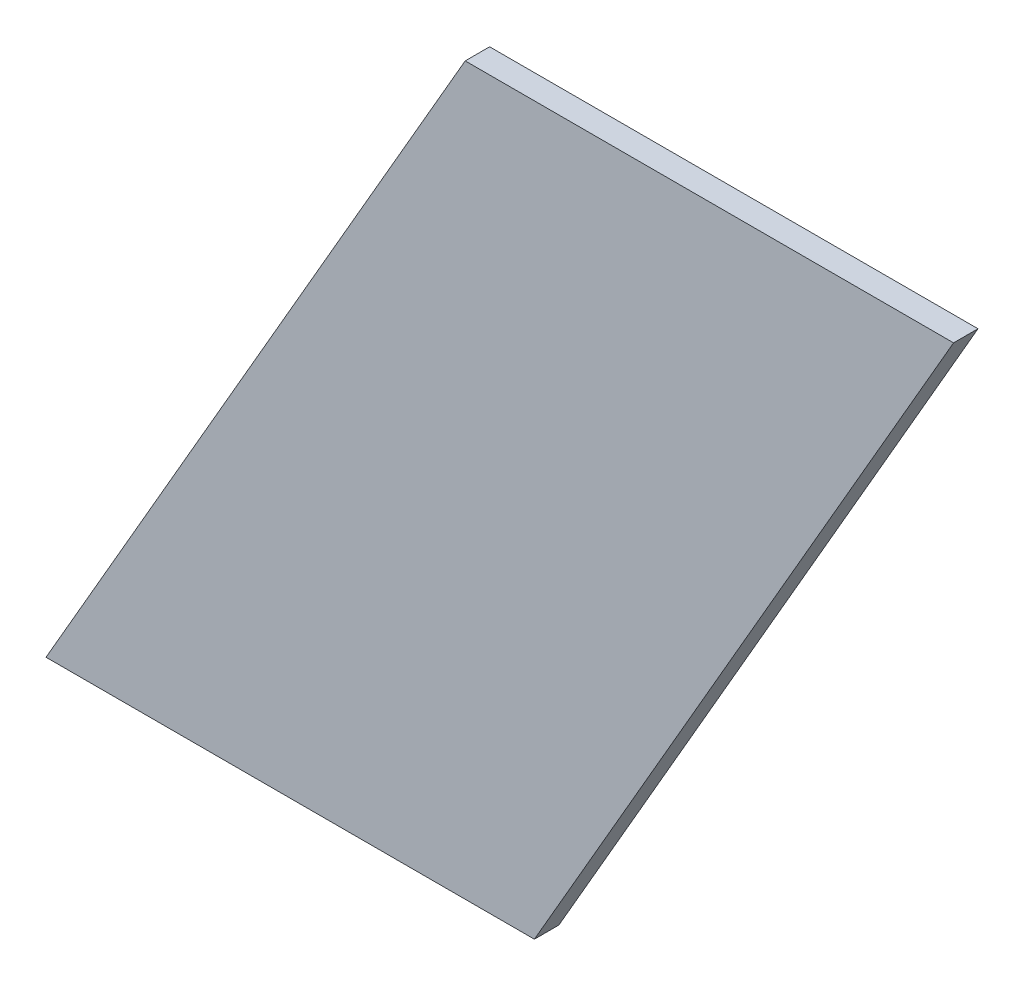
ISO-10303-21;
HEADER;
FILE_DESCRIPTION(('STEP AP214'),'2;1');
FILE_NAME('part.step','',(''),(''),'','','');
FILE_SCHEMA(('AUTOMOTIVE_DESIGN { 1 0 10303 214 1 1 1 1 }'));
ENDSEC;
DATA;
#1=APPLICATION_CONTEXT('core data for automotive mechanical design processes');
#2=APPLICATION_PROTOCOL_DEFINITION('international standard','automotive_design',2000,#1);
#3=PRODUCT_CONTEXT('',#1,'mechanical');
#4=PRODUCT('Part','Part','',(#3));
#5=PRODUCT_RELATED_PRODUCT_CATEGORY('part','',(#4));
#6=PRODUCT_DEFINITION_FORMATION('','',#4);
#7=PRODUCT_DEFINITION_CONTEXT('part definition',#1,'design');
#8=PRODUCT_DEFINITION('design','',#6,#7);
#9=PRODUCT_DEFINITION_SHAPE('','',#8);
#10=(LENGTH_UNIT() NAMED_UNIT(*) SI_UNIT(.MILLI.,.METRE.));
#11=(NAMED_UNIT(*) PLANE_ANGLE_UNIT() SI_UNIT($,.RADIAN.));
#12=(NAMED_UNIT(*) SI_UNIT($,.STERADIAN.) SOLID_ANGLE_UNIT());
#13=UNCERTAINTY_MEASURE_WITH_UNIT(LENGTH_MEASURE(1.E-05),#10,'distance_accuracy_value','');
#14=(GEOMETRIC_REPRESENTATION_CONTEXT(3) GLOBAL_UNCERTAINTY_ASSIGNED_CONTEXT((#13)) GLOBAL_UNIT_ASSIGNED_CONTEXT((#10,
#11,#12)) REPRESENTATION_CONTEXT('',''));
#15=CARTESIAN_POINT('',(0.,0.,0.));
#16=DIRECTION('',(0.,0.,1.));
#17=DIRECTION('',(1.,0.,0.));
#18=AXIS2_PLACEMENT_3D('',#15,#16,#17);
#19=CARTESIAN_POINT('',(0.557500000000002,0.446003082948985,0.015));
#20=DIRECTION('',(-0.866025403784436,0.500000000000004,0.));
#21=DIRECTION('',(-0.500000000000004,-0.866025403784436,0.));
#22=AXIS2_PLACEMENT_3D('',#19,#20,#21);
#23=PLANE('',#22);
#24=DIRECTION('',(0.500000000000004,0.866025403784436,0.));
#25=VECTOR('',#24,1.);
#26=CARTESIAN_POINT('',(0.557500000000002,0.446003082948985,-0.015));
#27=LINE('',#26,#25);
#28=CARTESIAN_POINT('',(0.0424999999999978,-0.446003082948985,-0.015));
#29=VERTEX_POINT('',#28);
#30=CARTESIAN_POINT('',(0.557500000000002,0.446003082948985,-0.015));
#31=VERTEX_POINT('',#30);
#32=EDGE_CURVE('E96',#29,#31,#27,.T.);
#33=ORIENTED_EDGE('',*,*,#32,.T.);
#34=DIRECTION('',(0.,0.,-1.));
#35=VECTOR('',#34,1.);
#36=CARTESIAN_POINT('',(0.557500000000002,0.446003082948985,0.015));
#37=LINE('',#36,#35);
#38=CARTESIAN_POINT('',(0.557500000000002,0.446003082948985,0.015));
#39=VERTEX_POINT('',#38);
#40=EDGE_CURVE('E11',#39,#31,#37,.T.);
#41=ORIENTED_EDGE('',*,*,#40,.F.);
#42=DIRECTION('',(0.500000000000004,0.866025403784436,0.));
#43=VECTOR('',#42,1.);
#44=CARTESIAN_POINT('',(0.557500000000002,0.446003082948985,0.015));
#45=LINE('',#44,#43);
#46=CARTESIAN_POINT('',(0.0424999999999978,-0.446003082948985,0.015));
#47=VERTEX_POINT('',#46);
#48=EDGE_CURVE('E84',#47,#39,#45,.T.);
#49=ORIENTED_EDGE('',*,*,#48,.F.);
#50=DIRECTION('',(0.,0.,-1.));
#51=VECTOR('',#50,1.);
#52=CARTESIAN_POINT('',(0.0424999999999978,-0.446003082948985,0.015));
#53=LINE('',#52,#51);
#54=EDGE_CURVE('E92',#47,#29,#53,.T.);
#55=ORIENTED_EDGE('',*,*,#54,.T.);
#56=EDGE_LOOP('',(#33,#41,#49,#55));
#57=FACE_BOUND('',#56,.T.);
#58=ADVANCED_FACE('F33',(#57),#23,.F.);
#59=CARTESIAN_POINT('',(-0.042499999999998,0.446003082948985,0.015));
#60=DIRECTION('',(0.,-1.,0.));
#61=DIRECTION('',(0.,0.,-1.));
#62=AXIS2_PLACEMENT_3D('',#59,#60,#61);
#63=PLANE('',#62);
#64=DIRECTION('',(-1.,0.,0.));
#65=VECTOR('',#64,1.);
#66=CARTESIAN_POINT('',(-0.042499999999998,0.446003082948985,-0.015));
#67=LINE('',#66,#65);
#68=CARTESIAN_POINT('',(-0.042499999999998,0.446003082948985,-0.015));
#69=VERTEX_POINT('',#68);
#70=EDGE_CURVE('E88',#31,#69,#67,.T.);
#71=ORIENTED_EDGE('',*,*,#70,.T.);
#72=DIRECTION('',(0.,0.,-1.));
#73=VECTOR('',#72,1.);
#74=CARTESIAN_POINT('',(-0.042499999999998,0.446003082948985,0.015));
#75=LINE('',#74,#73);
#76=CARTESIAN_POINT('',(-0.042499999999998,0.446003082948985,0.015));
#77=VERTEX_POINT('',#76);
#78=EDGE_CURVE('E41',#77,#69,#75,.T.);
#79=ORIENTED_EDGE('',*,*,#78,.F.);
#80=DIRECTION('',(-1.,0.,0.));
#81=VECTOR('',#80,1.);
#82=CARTESIAN_POINT('',(-0.042499999999998,0.446003082948985,0.015));
#83=LINE('',#82,#81);
#84=EDGE_CURVE('E79',#39,#77,#83,.T.);
#85=ORIENTED_EDGE('',*,*,#84,.F.);
#86=ORIENTED_EDGE('',*,*,#40,.T.);
#87=EDGE_LOOP('',(#71,#79,#85,#86));
#88=FACE_BOUND('',#87,.T.);
#89=ADVANCED_FACE('F87',(#88),#63,.F.);
#90=CARTESIAN_POINT('',(-0.042499999999998,0.446003082948985,0.015));
#91=DIRECTION('',(0.866025403784436,-0.500000000000004,0.));
#92=DIRECTION('',(0.500000000000004,0.866025403784436,0.));
#93=AXIS2_PLACEMENT_3D('',#90,#91,#92);
#94=PLANE('',#93);
#95=DIRECTION('',(-0.500000000000004,-0.866025403784436,0.));
#96=VECTOR('',#95,1.);
#97=CARTESIAN_POINT('',(-0.042499999999998,0.446003082948985,-0.015));
#98=LINE('',#97,#96);
#99=CARTESIAN_POINT('',(-0.557500000000002,-0.446003082948985,-0.015));
#100=VERTEX_POINT('',#99);
#101=EDGE_CURVE('E66',#69,#100,#98,.T.);
#102=ORIENTED_EDGE('',*,*,#101,.T.);
#103=DIRECTION('',(0.,0.,-1.));
#104=VECTOR('',#103,1.);
#105=CARTESIAN_POINT('',(-0.557500000000002,-0.446003082948985,0.015));
#106=LINE('',#105,#104);
#107=CARTESIAN_POINT('',(-0.557500000000002,-0.446003082948985,0.015));
#108=VERTEX_POINT('',#107);
#109=EDGE_CURVE('E89',#108,#100,#106,.T.);
#110=ORIENTED_EDGE('',*,*,#109,.F.);
#111=DIRECTION('',(-0.500000000000004,-0.866025403784436,0.));
#112=VECTOR('',#111,1.);
#113=CARTESIAN_POINT('',(-0.042499999999998,0.446003082948985,0.015));
#114=LINE('',#113,#112);
#115=EDGE_CURVE('E82',#77,#108,#114,.T.);
#116=ORIENTED_EDGE('',*,*,#115,.F.);
#117=ORIENTED_EDGE('',*,*,#78,.T.);
#118=EDGE_LOOP('',(#102,#110,#116,#117));
#119=FACE_BOUND('',#118,.T.);
#120=ADVANCED_FACE('F90',(#119),#94,.F.);
#121=CARTESIAN_POINT('',(-0.557500000000002,-0.446003082948985,0.015));
#122=DIRECTION('',(0.,1.,0.));
#123=DIRECTION('',(0.,0.,1.));
#124=AXIS2_PLACEMENT_3D('',#121,#122,#123);
#125=PLANE('',#124);
#126=DIRECTION('',(1.,0.,0.));
#127=VECTOR('',#126,1.);
#128=CARTESIAN_POINT('',(-0.557500000000002,-0.446003082948985,-0.015));
#129=LINE('',#128,#127);
#130=EDGE_CURVE('E72',#100,#29,#129,.T.);
#131=ORIENTED_EDGE('',*,*,#130,.T.);
#132=ORIENTED_EDGE('',*,*,#54,.F.);
#133=DIRECTION('',(1.,0.,0.));
#134=VECTOR('',#133,1.);
#135=CARTESIAN_POINT('',(-0.557500000000002,-0.446003082948985,0.015));
#136=LINE('',#135,#134);
#137=EDGE_CURVE('E49',#108,#47,#136,.T.);
#138=ORIENTED_EDGE('',*,*,#137,.F.);
#139=ORIENTED_EDGE('',*,*,#109,.T.);
#140=EDGE_LOOP('',(#131,#132,#138,#139));
#141=FACE_BOUND('',#140,.T.);
#142=ADVANCED_FACE('F103',(#141),#125,.F.);
#143=CARTESIAN_POINT('',(0.,0.,0.015));
#144=DIRECTION('',(0.,0.,1.));
#145=DIRECTION('',(1.,0.,0.));
#146=AXIS2_PLACEMENT_3D('',#143,#144,#145);
#147=PLANE('',#146);
#148=ORIENTED_EDGE('',*,*,#48,.T.);
#149=ORIENTED_EDGE('',*,*,#84,.T.);
#150=ORIENTED_EDGE('',*,*,#115,.T.);
#151=ORIENTED_EDGE('',*,*,#137,.T.);
#152=EDGE_LOOP('',(#148,#149,#150,#151));
#153=FACE_BOUND('',#152,.T.);
#154=ADVANCED_FACE('F80',(#153),#147,.T.);
#155=CARTESIAN_POINT('',(0.,0.,-0.015));
#156=DIRECTION('',(0.,0.,1.));
#157=DIRECTION('',(1.,0.,0.));
#158=AXIS2_PLACEMENT_3D('',#155,#156,#157);
#159=PLANE('',#158);
#160=ORIENTED_EDGE('',*,*,#32,.F.);
#161=ORIENTED_EDGE('',*,*,#130,.F.);
#162=ORIENTED_EDGE('',*,*,#101,.F.);
#163=ORIENTED_EDGE('',*,*,#70,.F.);
#164=EDGE_LOOP('',(#160,#161,#162,#163));
#165=FACE_BOUND('',#164,.T.);
#166=ADVANCED_FACE('F106',(#165),#159,.F.);
#167=CLOSED_SHELL('',(#58,#89,#120,#142,#154,#166));
#168=MANIFOLD_SOLID_BREP('B2',#167);
#169=ADVANCED_BREP_SHAPE_REPRESENTATION('',(#18,#168),#14);
#170=SHAPE_DEFINITION_REPRESENTATION(#9,#169);
ENDSEC;
END-ISO-10303-21;
